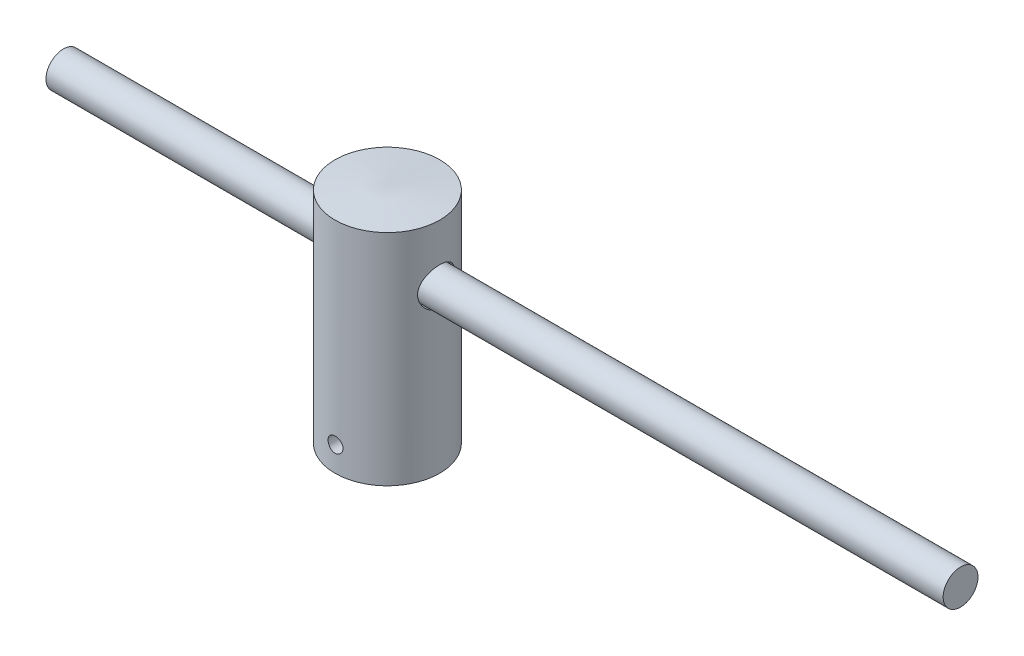
ISO-10303-21;
HEADER;
FILE_DESCRIPTION(('STEP AP214'),'2;1');
FILE_NAME('part.step','',(''),(''),'','','');
FILE_SCHEMA(('AUTOMOTIVE_DESIGN { 1 0 10303 214 1 1 1 1 }'));
ENDSEC;
DATA;
#1=APPLICATION_CONTEXT('core data for automotive mechanical design processes');
#2=APPLICATION_PROTOCOL_DEFINITION('international standard','automotive_design',2000,#1);
#3=PRODUCT_CONTEXT('',#1,'mechanical');
#4=PRODUCT('Part','Part','',(#3));
#5=PRODUCT_RELATED_PRODUCT_CATEGORY('part','',(#4));
#6=PRODUCT_DEFINITION_FORMATION('','',#4);
#7=PRODUCT_DEFINITION_CONTEXT('part definition',#1,'design');
#8=PRODUCT_DEFINITION('design','',#6,#7);
#9=PRODUCT_DEFINITION_SHAPE('','',#8);
#10=(LENGTH_UNIT() NAMED_UNIT(*) SI_UNIT(.MILLI.,.METRE.));
#11=(NAMED_UNIT(*) PLANE_ANGLE_UNIT() SI_UNIT($,.RADIAN.));
#12=(NAMED_UNIT(*) SI_UNIT($,.STERADIAN.) SOLID_ANGLE_UNIT());
#13=UNCERTAINTY_MEASURE_WITH_UNIT(LENGTH_MEASURE(1.E-05),#10,'distance_accuracy_value','');
#14=(GEOMETRIC_REPRESENTATION_CONTEXT(3) GLOBAL_UNCERTAINTY_ASSIGNED_CONTEXT((#13)) GLOBAL_UNIT_ASSIGNED_CONTEXT((#10,
#11,#12)) REPRESENTATION_CONTEXT('',''));
#15=CARTESIAN_POINT('',(0.,0.,0.));
#16=DIRECTION('',(0.,0.,1.));
#17=DIRECTION('',(1.,0.,0.));
#18=AXIS2_PLACEMENT_3D('',#15,#16,#17);
#19=CARTESIAN_POINT('',(-130.,65.,0.));
#20=DIRECTION('',(1.,0.,0.));
#21=DIRECTION('',(0.,0.,-1.));
#22=AXIS2_PLACEMENT_3D('',#19,#20,#21);
#23=CYLINDRICAL_SURFACE('',#22,6.99209056168372);
#24=CARTESIAN_POINT('',(-130.,65.,0.));
#25=DIRECTION('',(1.,0.,0.));
#26=DIRECTION('',(0.,0.,-1.));
#27=AXIS2_PLACEMENT_3D('',#24,#25,#26);
#28=CIRCLE('',#27,6.99209056168372);
#29=CARTESIAN_POINT('',(-130.,65.,-6.99209056168372));
#30=VERTEX_POINT('',#29);
#31=EDGE_CURVE('E11',#30,#30,#28,.T.);
#32=ORIENTED_EDGE('',*,*,#31,.T.);
#33=EDGE_LOOP('',(#32));
#34=FACE_BOUND('',#33,.T.);
#35=CARTESIAN_POINT('',(230.,65.,0.));
#36=DIRECTION('',(1.,0.,0.));
#37=DIRECTION('',(0.,0.,-1.));
#38=AXIS2_PLACEMENT_3D('',#35,#36,#37);
#39=CIRCLE('',#38,6.99209056168372);
#40=CARTESIAN_POINT('',(230.,65.,-6.99209056168372));
#41=VERTEX_POINT('',#40);
#42=EDGE_CURVE('E47',#41,#41,#39,.T.);
#43=ORIENTED_EDGE('',*,*,#42,.F.);
#44=EDGE_LOOP('',(#43));
#45=FACE_BOUND('',#44,.T.);
#46=ADVANCED_FACE('F41',(#34,#45),#23,.T.);
#47=CARTESIAN_POINT('',(-130.,65.,0.));
#48=DIRECTION('',(1.,0.,0.));
#49=DIRECTION('',(0.,0.,-1.));
#50=AXIS2_PLACEMENT_3D('',#47,#48,#49);
#51=PLANE('',#50);
#52=ORIENTED_EDGE('',*,*,#31,.F.);
#53=EDGE_LOOP('',(#52));
#54=FACE_BOUND('',#53,.T.);
#55=ADVANCED_FACE('F56',(#54),#51,.F.);
#56=CARTESIAN_POINT('',(230.,65.,0.));
#57=DIRECTION('',(1.,0.,0.));
#58=DIRECTION('',(0.,0.,-1.));
#59=AXIS2_PLACEMENT_3D('',#56,#57,#58);
#60=PLANE('',#59);
#61=ORIENTED_EDGE('',*,*,#42,.T.);
#62=EDGE_LOOP('',(#61));
#63=FACE_BOUND('',#62,.T.);
#64=ADVANCED_FACE('F53',(#63),#60,.T.);
#65=CLOSED_SHELL('',(#46,#55,#64));
#66=MANIFOLD_SOLID_BREP('B2',#65);
#67=CARTESIAN_POINT('',(0.,19.2494269938011,0.));
#68=DIRECTION('',(0.,1.,0.));
#69=DIRECTION('',(0.,0.,1.));
#70=AXIS2_PLACEMENT_3D('',#67,#68,#69);
#71=CYLINDRICAL_SURFACE('',#70,21.);
#72=CARTESIAN_POINT('',(-21.,72.5,0.));
#73=CARTESIAN_POINT('',(-21.0000003810516,72.5000005363568,-0.20374922618558));
#74=CARTESIAN_POINT('',(-20.9970281712498,72.4916907794428,-0.407490675864005));
#75=CARTESIAN_POINT('',(-20.985221568696,72.4585364170613,-0.813454356854692));
#76=CARTESIAN_POINT('',(-20.9763871824079,72.4336918298256,-1.01567658984185));
#77=CARTESIAN_POINT('',(-20.9530966718926,72.3677140587623,-1.4170962565951));
#78=CARTESIAN_POINT('',(-20.938640980598,72.3265821293227,-1.61629392207521));
#79=CARTESIAN_POINT('',(-20.90449489973,72.2284177092016,-2.01027190534673));
#80=CARTESIAN_POINT('',(-20.8848044170413,72.1713849356789,-2.20505214449517));
#81=CARTESIAN_POINT('',(-20.8407519298997,72.0420612505437,-2.58847971348074));
#82=CARTESIAN_POINT('',(-20.8163995609771,71.9698017800823,-2.77713877045418));
#83=CARTESIAN_POINT('',(-20.7636131163567,71.8105267445053,-3.14760137243779));
#84=CARTESIAN_POINT('',(-20.7351776236549,71.7235060547595,-3.32940250970902));
#85=CARTESIAN_POINT('',(-20.6749513548944,71.5354072492348,-3.68495547941489));
#86=CARTESIAN_POINT('',(-20.6431611165465,71.4343313854481,-3.85870859541115));
#87=CARTESIAN_POINT('',(-20.5769959385094,71.2187847383418,-4.19726138746945));
#88=CARTESIAN_POINT('',(-20.5426200697334,71.1043091318351,-4.36205780815527));
#89=CARTESIAN_POINT('',(-20.4708979079837,70.858494600442,-4.6873275904472));
#90=CARTESIAN_POINT('',(-20.4334897355097,70.7267052975204,-4.84744706169194));
#91=CARTESIAN_POINT('',(-20.3577917988584,70.4504432303281,-5.15611984149657));
#92=CARTESIAN_POINT('',(-20.31950201173,70.3059701355822,-5.3046728485027));
#93=CARTESIAN_POINT('',(-20.2430325297971,70.0051504838689,-5.58939854738355));
#94=CARTESIAN_POINT('',(-20.2048528888019,69.8487988982054,-5.72556594167039));
#95=CARTESIAN_POINT('',(-20.1296574136624,69.5252461914804,-5.98456978175054));
#96=CARTESIAN_POINT('',(-20.0926411879885,69.358048779731,-6.10741074722057));
#97=CARTESIAN_POINT('',(-20.0195447238613,69.0078039224979,-6.34299322543321));
#98=CARTESIAN_POINT('',(-19.9835402998257,68.8244093246782,-6.45524294854224));
#99=CARTESIAN_POINT('',(-19.9149719598628,68.4482298485128,-6.66377833599417));
#100=CARTESIAN_POINT('',(-19.8824067643259,68.2554485019121,-6.76006994540559));
#101=CARTESIAN_POINT('',(-19.8217477215098,67.861730867444,-6.93591912307201));
#102=CARTESIAN_POINT('',(-19.7936535229621,67.6607952217858,-7.01547800610893));
#103=CARTESIAN_POINT('',(-19.7428794672938,67.2521917401856,-7.15712087737874));
#104=CARTESIAN_POINT('',(-19.7201993257047,67.0445242586031,-7.21920578377031));
#105=CARTESIAN_POINT('',(-19.6817901185185,66.6320005871443,-7.32325729118184));
#106=CARTESIAN_POINT('',(-19.6658304611613,66.4273354635075,-7.36589638345197));
#107=CARTESIAN_POINT('',(-19.6401986039845,66.0147785485371,-7.43397115490169));
#108=CARTESIAN_POINT('',(-19.630526064353,65.8068869322138,-7.45940776385967));
#109=CARTESIAN_POINT('',(-19.6178050549232,65.3895643424967,-7.49279957655505));
#110=CARTESIAN_POINT('',(-19.6147545997322,65.1801338493793,-7.50076001989667));
#111=CARTESIAN_POINT('',(-19.615379526299,64.7613551297721,-7.49912586169239));
#112=CARTESIAN_POINT('',(-19.6190546799858,64.5520069007334,-7.48953185543191));
#113=CARTESIAN_POINT('',(-19.6326246436368,64.146281450242,-7.45388383321767));
#114=CARTESIAN_POINT('',(-19.6421746424614,63.9498116942469,-7.42874196130756));
#115=CARTESIAN_POINT('',(-19.6668861771582,63.5597541033493,-7.3630712300169));
#116=CARTESIAN_POINT('',(-19.6820495535895,63.3661672353922,-7.32253732366088));
#117=CARTESIAN_POINT('',(-19.7175242634513,62.9832962337792,-7.22646893238065));
#118=CARTESIAN_POINT('',(-19.737834229786,62.7940109720087,-7.17093843076608));
#119=CARTESIAN_POINT('',(-19.7830191374593,62.4208191375838,-7.04532511235293));
#120=CARTESIAN_POINT('',(-19.8078958192165,62.2369146466779,-6.97523674607068));
#121=CARTESIAN_POINT('',(-19.861976746623,61.8725166896213,-6.8197338039181));
#122=CARTESIAN_POINT('',(-19.8912486222834,61.6921378637165,-6.73407428540257));
#123=CARTESIAN_POINT('',(-19.9529856831819,61.3391457987089,-6.54888444422275));
#124=CARTESIAN_POINT('',(-19.9854519551971,61.1665352317839,-6.4493493960803));
#125=CARTESIAN_POINT('',(-20.0527070880428,60.8300792618337,-6.23709299084689));
#126=CARTESIAN_POINT('',(-20.0874961671456,60.6662346851547,-6.12437039378196));
#127=CARTESIAN_POINT('',(-20.1585021087452,60.3482003787496,-5.88644235055393));
#128=CARTESIAN_POINT('',(-20.1947190295132,60.1940110437266,-5.76123639461683));
#129=CARTESIAN_POINT('',(-20.2698966308978,59.8870576705367,-5.49109434290394));
#130=CARTESIAN_POINT('',(-20.3088903501962,59.7349490688169,-5.34542176541262));
#131=CARTESIAN_POINT('',(-20.3863902720736,59.443504603503,-5.04178840291438));
#132=CARTESIAN_POINT('',(-20.4248966214334,59.3041648114501,-4.88383142516874));
#133=CARTESIAN_POINT('',(-20.5004138581661,59.0390329744161,-4.55645258274398));
#134=CARTESIAN_POINT('',(-20.5374239787312,58.9132478224565,-4.38702495546978));
#135=CARTESIAN_POINT('',(-20.6089136572418,58.6762283831301,-4.03787261993808));
#136=CARTESIAN_POINT('',(-20.6433942186196,58.5649883121318,-3.85815204564512));
#137=CARTESIAN_POINT('',(-20.7093392629055,58.356457936562,-3.48701232511264));
#138=CARTESIAN_POINT('',(-20.7407573854129,58.2593734742781,-3.29546911991382));
#139=CARTESIAN_POINT('',(-20.7991423769345,58.0818098762803,-2.90426698302876));
#140=CARTESIAN_POINT('',(-20.8261109936778,58.001324217573,-2.70461127645546));
#141=CARTESIAN_POINT('',(-20.8748266299074,57.8576645516751,-2.2985678507468));
#142=CARTESIAN_POINT('',(-20.8965742790775,57.7944884567047,-2.0921809468529));
#143=CARTESIAN_POINT('',(-20.9342058498115,57.6860705695252,-1.67422766214545));
#144=CARTESIAN_POINT('',(-20.9500900859828,57.6408278150745,-1.46266155987686));
#145=CARTESIAN_POINT('',(-20.9748940759281,57.5705177480786,-1.04648402034207));
#146=CARTESIAN_POINT('',(-20.9841165402028,57.5445716633572,-0.84203872873714));
#147=CARTESIAN_POINT('',(-20.9965698462835,57.50959181003,-0.431527335545403));
#148=CARTESIAN_POINT('',(-20.9998009100344,57.5005574149485,-0.225461294281526));
#149=CARTESIAN_POINT('',(-21.0001811885606,57.4994927090519,0.186683488447177));
#150=CARTESIAN_POINT('',(-20.997331453116,57.5074594631835,0.392762221579025));
#151=CARTESIAN_POINT('',(-20.9856319191329,57.5403094820346,0.803392653199922));
#152=CARTESIAN_POINT('',(-20.9767821975247,57.5651925298579,1.00794437123396));
#153=CARTESIAN_POINT('',(-20.9537333077164,57.6304793183805,1.40699201212888));
#154=CARTESIAN_POINT('',(-20.9397286698676,57.6703195946823,1.60159177108016));
#155=CARTESIAN_POINT('',(-20.9067082485523,57.7651933643484,1.98668319578029));
#156=CARTESIAN_POINT('',(-20.8876908067584,57.8202318858584,2.17717347943642));
#157=CARTESIAN_POINT('',(-20.8451303655555,57.9450091423219,2.55269301105831));
#158=CARTESIAN_POINT('',(-20.8215885875091,58.0147439104547,2.73772371734372));
#159=CARTESIAN_POINT('',(-20.7705461329668,58.1683942676792,3.10131125455071));
#160=CARTESIAN_POINT('',(-20.7430439565874,58.2523152314751,3.27986560052499));
#161=CARTESIAN_POINT('',(-20.6839387126469,58.4362273457668,3.63425989160507));
#162=CARTESIAN_POINT('',(-20.6522428011238,58.5366008067195,3.80988592008421));
#163=CARTESIAN_POINT('',(-20.5861592917809,58.7509719201664,4.15216110518901));
#164=CARTESIAN_POINT('',(-20.5517707691071,58.8649742610336,4.31880714390743));
#165=CARTESIAN_POINT('',(-20.4811587516689,59.1058401866037,4.64214676449224));
#166=CARTESIAN_POINT('',(-20.4449350250787,59.2327053982017,4.7988390833259));
#167=CARTESIAN_POINT('',(-20.3715502904862,59.498511459249,5.10138952445933));
#168=CARTESIAN_POINT('',(-20.3343892526384,59.6374526935642,5.24724730118454));
#169=CARTESIAN_POINT('',(-20.2580914243843,59.9342424917553,5.5347085066744));
#170=CARTESIAN_POINT('',(-20.2189537829847,60.0927017325284,5.67568199313652));
#171=CARTESIAN_POINT('',(-20.1417711703012,60.421091504049,5.94377932163782));
#172=CARTESIAN_POINT('',(-20.103725847122,60.5910182800045,6.07090766167138));
#173=CARTESIAN_POINT('',(-20.0297914257965,60.9414431936632,6.3105620133107));
#174=CARTESIAN_POINT('',(-19.9939033281997,61.1219461612576,6.423081276675));
#175=CARTESIAN_POINT('',(-19.9253902921786,61.492256443821,6.63256872058112));
#176=CARTESIAN_POINT('',(-19.8927639874725,61.6820598130235,6.72954342270005));
#177=CARTESIAN_POINT('',(-19.8317291730711,62.0701120108024,6.90734196879382));
#178=CARTESIAN_POINT('',(-19.8033272787358,62.2683734727339,6.98814054826929));
#179=CARTESIAN_POINT('',(-19.7517454068301,62.6716092182904,7.13263226499261));
#180=CARTESIAN_POINT('',(-19.7285632742586,62.8765806914775,7.19633246347536));
#181=CARTESIAN_POINT('',(-19.6882067233635,63.2917412098529,7.30602055083928));
#182=CARTESIAN_POINT('',(-19.6710308394705,63.5019289688037,7.35201276087867));
#183=CARTESIAN_POINT('',(-19.6432929629954,63.9259015110794,7.42580656271277));
#184=CARTESIAN_POINT('',(-19.6327305678251,64.1396860746392,7.45360926177694));
#185=CARTESIAN_POINT('',(-19.6190191685864,64.5564678556715,7.48962147186352));
#186=CARTESIAN_POINT('',(-19.615471330387,64.7593615093909,7.49888546968745));
#187=CARTESIAN_POINT('',(-19.614691614171,65.1652419736128,7.50092504129694));
#188=CARTESIAN_POINT('',(-19.6174595603318,65.3682287813648,7.49370107408394));
#189=CARTESIAN_POINT('',(-19.6292196469906,65.7727483445713,7.46284168144581));
#190=CARTESIAN_POINT('',(-19.6382112642765,65.974281220816,7.43920763558364));
#191=CARTESIAN_POINT('',(-19.6621249112348,66.3744255519295,7.37577047765268));
#192=CARTESIAN_POINT('',(-19.6770469486956,66.5730370029611,7.33596734434881));
#193=CARTESIAN_POINT('',(-19.7118987278182,66.9609502001794,7.24178833075198));
#194=CARTESIAN_POINT('',(-19.7316920362282,67.1503603284884,7.18780715645808));
#195=CARTESIAN_POINT('',(-19.7758888598513,67.5239255276664,7.06529958358312));
#196=CARTESIAN_POINT('',(-19.8002939018927,67.7080788348265,6.99676836692036));
#197=CARTESIAN_POINT('',(-19.8530230260859,68.0699436049032,6.84571900682037));
#198=CARTESIAN_POINT('',(-19.8813464405889,68.247656158759,6.76320324566223));
#199=CARTESIAN_POINT('',(-19.9411537561819,68.5956998861985,6.58477330804461));
#200=CARTESIAN_POINT('',(-19.9726388792857,68.7660281690316,6.48885394538428));
#201=CARTESIAN_POINT('',(-20.0737851956973,69.2805695731914,6.17202295503216));
#202=CARTESIAN_POINT('',(-20.1474848969218,69.6108756547118,5.92929000232938));
#203=CARTESIAN_POINT('',(-20.2974294582159,70.2273710086492,5.39364701200401));
#204=CARTESIAN_POINT('',(-20.3736750822788,70.5135468908554,5.10072180148509));
#205=CARTESIAN_POINT('',(-20.4858363888957,70.9107209924108,4.62160836442627));
#206=CARTESIAN_POINT('',(-20.5236794040509,71.0402804051611,4.45095268758888));
#207=CARTESIAN_POINT('',(-20.5968864447148,71.2845293587603,4.09884639312128));
#208=CARTESIAN_POINT('',(-20.6322514008331,71.3992244956313,3.9173998757205));
#209=CARTESIAN_POINT('',(-20.6995253298715,71.6129147487263,3.54478695548017));
#210=CARTESIAN_POINT('',(-20.7314329723786,71.7119038278386,3.35361685218406));
#211=CARTESIAN_POINT('',(-20.7908567210666,71.8932621536529,2.96298497408958));
#212=CARTESIAN_POINT('',(-20.8183747346387,71.9756386230364,2.7635268483717));
#213=CARTESIAN_POINT('',(-20.8683456171222,72.1233916209485,2.35676094636663));
#214=CARTESIAN_POINT('',(-20.8907752456181,72.1886903488701,2.14942201110688));
#215=CARTESIAN_POINT('',(-20.9297375531609,72.3011436996212,1.7293289794983));
#216=CARTESIAN_POINT('',(-20.9462701613011,72.3482981042812,1.51657481806893));
#217=CARTESIAN_POINT('',(-20.9729268107105,72.423941899677,1.08744616397812));
#218=CARTESIAN_POINT('',(-20.9830529466634,72.4524373913064,0.871072878414159));
#219=CARTESIAN_POINT('',(-20.9965891316789,72.4904655738222,0.436463345011874));
#220=CARTESIAN_POINT('',(-20.9999995918717,72.4999994255309,0.218227212037681));
#221=CARTESIAN_POINT('',(-21.,72.5,0.));
#222=B_SPLINE_CURVE_WITH_KNOTS('',3,(#72,#73,#74,#75,#76,#77,#78,#79,#80,#81,#82,#83,#84,#85,
#86,#87,#88,#89,#90,#91,#92,#93,#94,#95,#96,#97,#98,#99,#100,#101,#102,#103,#104,#105,#106,#107,
#108,#109,#110,#111,#112,#113,#114,#115,#116,#117,#118,#119,#120,#121,#122,#123,#124,#125,#126,
#127,#128,#129,#130,#131,#132,#133,#134,#135,#136,#137,#138,#139,#140,#141,#142,#143,#144,#145,
#146,#147,#148,#149,#150,#151,#152,#153,#154,#155,#156,#157,#158,#159,#160,#161,#162,#163,#164,
#165,#166,#167,#168,#169,#170,#171,#172,#173,#174,#175,#176,#177,#178,#179,#180,#181,#182,#183,
#184,#185,#186,#187,#188,#189,#190,#191,#192,#193,#194,#195,#196,#197,#198,#199,#200,#201,#202,
#203,#204,#205,#206,#207,#208,#209,#210,#211,#212,#213,#214,#215,#216,#217,#218,#219,#220,#221),
.UNSPECIFIED.,.T.,.F.,(4,2,2,2,2,2,2,2,2,2,2,2,2,2,2,2,2,2,2,2,2,2,2,2,2,2,2,2,2,2,2,2,2,2,2,2,
2,2,2,2,2,2,2,2,2,2,2,2,2,2,2,2,2,2,2,2,2,2,2,2,2,2,2,2,2,2,2,2,2,2,2,2,2,2,4),(0.,
0.611044132039879,1.22208759032251,1.83308399755512,2.444091273768,3.05384905010863,
3.6638189500155,4.27369122978189,4.88378370976459,5.51525663850016,6.14674602510165,
6.77850425525973,7.41004754945584,8.06328199199794,8.71627252750716,9.36921173478995,
10.0221166274008,10.6503108641732,11.2784711449109,11.906443068484,12.534393697422,
13.1286027202202,13.7230067498298,14.3172530522687,14.9117262995606,15.5165197015441,
16.1215195786632,16.7265763873582,17.3316579144525,17.9734922695032,18.6151284897875,
19.2570894804428,19.8987944236635,20.5490580649612,21.1990656768324,21.8489948539846,
22.4988891534427,23.1169880240698,23.7350639974289,24.3530332757041,24.9709946306905,
25.5676942795542,26.1645915758934,26.7613279631959,27.3582909439843,27.9718713163964,
28.5856633728627,29.1995331587884,29.8134225160795,30.4596841304044,31.1057351577496,
31.752083555985,32.3981600709447,33.0452379136885,33.6920481157015,34.3387003808968,
34.9853132780765,35.5939634189303,36.2025966160382,36.8111786527468,37.4197614887171,
38.0129274440146,38.6062901267069,39.1995518309739,39.7930437224708,41.0366567215566,
42.2806463247071,42.9327171422873,43.584541754198,44.2366163113363,44.8884067512212,
45.5431167545441,46.1978346299334,46.8523383255764,47.5068019515908),.UNSPECIFIED.);
#223=CARTESIAN_POINT('',(-21.,72.5,0.));
#224=VERTEX_POINT('',#223);
#225=EDGE_CURVE('E39',#224,#224,#222,.T.);
#226=ORIENTED_EDGE('',*,*,#225,.F.);
#227=EDGE_LOOP('',(#226));
#228=FACE_BOUND('',#227,.T.);
#229=CARTESIAN_POINT('',(19.615045245933,65.,-7.50000000000001));
#230=CARTESIAN_POINT('',(19.6150447670643,65.2032803024815,-7.50000055518975));
#231=CARTESIAN_POINT('',(19.6182137941462,65.4065527092552,-7.49172867514459));
#232=CARTESIAN_POINT('',(19.6307837848207,65.8115650728511,-7.45872914623714));
#233=CARTESIAN_POINT('',(19.6401847633366,66.0133050260026,-7.43400145796937));
#234=CARTESIAN_POINT('',(19.6649118884163,66.4137555013908,-7.36834218067001));
#235=CARTESIAN_POINT('',(19.6802380337111,66.6124660242764,-7.3274105951091));
#236=CARTESIAN_POINT('',(19.716327336131,67.0054564372987,-7.2297401241124));
#237=CARTESIAN_POINT('',(19.737090603043,67.1997362378836,-7.17300091948617));
#238=CARTESIAN_POINT('',(19.7833587440972,67.5820957095414,-7.04438574105221));
#239=CARTESIAN_POINT('',(19.8088519464002,67.7701893291638,-6.97254697097581));
#240=CARTESIAN_POINT('',(19.8638739285575,68.1395634875481,-6.81421558054032));
#241=CARTESIAN_POINT('',(19.8934041138899,68.3208416253469,-6.72771785413202));
#242=CARTESIAN_POINT('',(19.9556588092682,68.6754299396379,-6.54074792718216));
#243=CARTESIAN_POINT('',(19.9883828872962,68.8487411891093,-6.44027761584625));
#244=CARTESIAN_POINT('',(20.0561594074473,69.1865165915411,-6.22600172757715));
#245=CARTESIAN_POINT('',(20.091212687483,69.3509775217377,-6.11219134028183));
#246=CARTESIAN_POINT('',(20.1641865370976,69.6766028372198,-5.86707653932671));
#247=CARTESIAN_POINT('',(20.2021657404097,69.8373600248745,-5.73524834866052));
#248=CARTESIAN_POINT('',(20.2786180847038,70.1473211965175,-5.4587742039024));
#249=CARTESIAN_POINT('',(20.3170912367886,70.2965249202816,-5.31412796126074));
#250=CARTESIAN_POINT('',(20.3935214464471,70.5825368521613,-5.01282778358481));
#251=CARTESIAN_POINT('',(20.431478312898,70.7193405706782,-4.85616953702909));
#252=CARTESIAN_POINT('',(20.5058491228181,70.9795814983578,-4.5318665956045));
#253=CARTESIAN_POINT('',(20.5422635983779,71.1030233403114,-4.36422574116336));
#254=CARTESIAN_POINT('',(20.6136948439598,71.3393609714963,-4.01354925305805));
#255=CARTESIAN_POINT('',(20.6486335547648,71.4518125200111,-3.8301978463723));
#256=CARTESIAN_POINT('',(20.7148695672051,71.6607536101794,-3.45407353030378));
#257=CARTESIAN_POINT('',(20.7461682257485,71.7572491054909,-3.26130416996665));
#258=CARTESIAN_POINT('',(20.8042409241113,71.9334959609181,-2.86760270907143));
#259=CARTESIAN_POINT('',(20.8310151529941,72.0132480207295,-2.66667095003291));
#260=CARTESIAN_POINT('',(20.8792549212092,72.1552603574421,-2.25810014498465));
#261=CARTESIAN_POINT('',(20.900720724635,72.2175215045349,-2.05046143322628));
#262=CARTESIAN_POINT('',(20.9369724595446,72.321824249659,-1.63837281099333));
#263=CARTESIAN_POINT('',(20.951988587254,72.3645668651759,-1.43412046948895));
#264=CARTESIAN_POINT('',(20.9761091258023,72.4329119009837,-1.02242632744536));
#265=CARTESIAN_POINT('',(20.9852138101725,72.458515114342,-0.814984674935063));
#266=CARTESIAN_POINT('',(20.9972505045753,72.492314626272,-0.398559749458603));
#267=CARTESIAN_POINT('',(21.000184007056,72.5005151335448,-0.189576861498642));
#268=CARTESIAN_POINT('',(20.9997981095233,72.4994347928021,0.228335180074842));
#269=CARTESIAN_POINT('',(20.9964788785977,72.4901544175083,0.437264334988617));
#270=CARTESIAN_POINT('',(20.9839737616737,72.455025574372,0.844017651723146));
#271=CARTESIAN_POINT('',(20.9750597211401,72.4299446377546,1.04191704568063));
#272=CARTESIAN_POINT('',(20.9518484921181,72.3641633895244,1.4348485227359));
#273=CARTESIAN_POINT('',(20.9375495270247,72.3234579229503,1.62987963743597));
#274=CARTESIAN_POINT('',(20.9039414359622,72.2268123835607,2.01561539231386));
#275=CARTESIAN_POINT('',(20.8846339318383,72.1708772420673,2.20632141132882));
#276=CARTESIAN_POINT('',(20.8414855572985,72.0442220407378,2.58230598983492));
#277=CARTESIAN_POINT('',(20.8176429722475,71.9734963878577,2.76758246583483));
#278=CARTESIAN_POINT('',(20.765666387993,71.8167762092565,3.13397571848474));
#279=CARTESIAN_POINT('',(20.7374783145666,71.7305866653112,3.31500134887542));
#280=CARTESIAN_POINT('',(20.6777465612265,71.5442335410281,3.66920572822596));
#281=CARTESIAN_POINT('',(20.6462017363753,71.4440651890772,3.84238177090474));
#282=CARTESIAN_POINT('',(20.5805343797436,71.2304671801756,4.17985166014691));
#283=CARTESIAN_POINT('',(20.5464116538099,71.1170365240288,4.34414483610022));
#284=CARTESIAN_POINT('',(20.4764161945623,70.8776458258923,4.6629410036605));
#285=CARTESIAN_POINT('',(20.4405433878636,70.7516852582641,4.81744358409971));
#286=CARTESIAN_POINT('',(20.3659611188873,70.480894860604,5.12384698105041));
#287=CARTESIAN_POINT('',(20.3272028134452,70.335414776893,5.2751618057852));
#288=CARTESIAN_POINT('',(20.2497628200464,70.0323303986232,5.56503468590094));
#289=CARTESIAN_POINT('',(20.2110811122533,69.8747298324756,5.70359663564191));
#290=CARTESIAN_POINT('',(20.1348212347983,69.5482121813542,5.96722869150979));
#291=CARTESIAN_POINT('',(20.0972437118938,69.3792886469808,6.09229100074736));
#292=CARTESIAN_POINT('',(20.0242924713956,69.0312800444747,6.32794789765442));
#293=CARTESIAN_POINT('',(19.9889178972121,68.8521989783883,6.43854812735704));
#294=CARTESIAN_POINT('',(19.9207532335694,68.4814127579886,6.64648739855475));
#295=CARTESIAN_POINT('',(19.8880249127895,68.2895325525497,6.74353502535966));
#296=CARTESIAN_POINT('',(19.8269724640454,67.8976329252264,6.92098045672197));
#297=CARTESIAN_POINT('',(19.7986465944068,67.6976167617624,7.00138484978623));
#298=CARTESIAN_POINT('',(19.7473335603474,67.2908245183929,7.14483208610425));
#299=CARTESIAN_POINT('',(19.7243453361935,67.0840497896447,7.20787837608828));
#300=CARTESIAN_POINT('',(19.6845042432106,66.66527350521,7.31598387992431));
#301=CARTESIAN_POINT('',(19.6676510004286,66.4532722689427,7.3610441901143));
#302=CARTESIAN_POINT('',(19.641374523921,66.0366282833857,7.43086293442179));
#303=CARTESIAN_POINT('',(19.6316169396673,65.8321598107087,7.45653751451895));
#304=CARTESIAN_POINT('',(19.6185030472952,65.4216021155907,7.49097334958786));
#305=CARTESIAN_POINT('',(19.6151464660411,65.215512962682,7.49973532623337));
#306=CARTESIAN_POINT('',(19.6149485609945,64.80335051523,7.50025281276369));
#307=CARTESIAN_POINT('',(19.6181060077236,64.597277225034,7.49201153189743));
#308=CARTESIAN_POINT('',(19.6308263474053,64.1867083787303,7.45861751801893));
#309=CARTESIAN_POINT('',(19.6403891377466,63.9822127974013,7.43346505591748));
#310=CARTESIAN_POINT('',(19.6650714426541,63.5848257187798,7.36791229634306));
#311=CARTESIAN_POINT('',(19.6799425069577,63.3918060176793,7.32819186092932));
#312=CARTESIAN_POINT('',(19.7148284252235,63.0098642589306,7.23381429227787));
#313=CARTESIAN_POINT('',(19.7348449700465,62.8209435704344,7.17915224869079));
#314=CARTESIAN_POINT('',(19.7794327480716,62.4485021720896,7.05537817622268));
#315=CARTESIAN_POINT('',(19.8040030073786,62.264980317308,6.98626923667088));
#316=CARTESIAN_POINT('',(19.8570246446707,61.904315229268,6.83411012080573));
#317=CARTESIAN_POINT('',(19.8854775015188,61.7271744591885,6.75105462952455));
#318=CARTESIAN_POINT('',(19.9465387390797,61.3743073524223,6.56849839376502));
#319=CARTESIAN_POINT('',(19.9792570979328,61.1988436494866,6.46852680317899));
#320=CARTESIAN_POINT('',(20.0471398184912,60.856821883945,6.25497703382267));
#321=CARTESIAN_POINT('',(20.0823050204754,60.6902669157951,6.14139417099034));
#322=CARTESIAN_POINT('',(20.1541474319754,60.3670206345006,5.90135858917506));
#323=CARTESIAN_POINT('',(20.1908248290416,60.2103305509783,5.77490427093175));
#324=CARTESIAN_POINT('',(20.2647494897835,59.9076912328985,5.50988666803687));
#325=CARTESIAN_POINT('',(20.3019967695808,59.7617423028843,5.37132304029425));
#326=CARTESIAN_POINT('',(20.3782354997607,59.4734373634752,5.07467012372221));
#327=CARTESIAN_POINT('',(20.417205896993,59.3317559200274,4.91591888788194));
#328=CARTESIAN_POINT('',(20.4936539113377,59.0622779308787,4.58679386956002));
#329=CARTESIAN_POINT('',(20.5311320158988,58.9344768272856,4.41642393241323));
#330=CARTESIAN_POINT('',(20.6035930569911,58.6935545814404,4.06499064199812));
#331=CARTESIAN_POINT('',(20.6385749857326,58.5804393534325,3.88392302304581));
#332=CARTESIAN_POINT('',(20.7050411229691,58.3698636025321,3.51238734558814));
#333=CARTESIAN_POINT('',(20.736526812288,58.2723964440783,3.32192331665945));
#334=CARTESIAN_POINT('',(20.7949926208202,58.0942948398713,2.93370570622313));
#335=CARTESIAN_POINT('',(20.8219930804186,58.0135839637755,2.73599029068247));
#336=CARTESIAN_POINT('',(20.870885556903,57.8691879420306,2.33390822376345));
#337=CARTESIAN_POINT('',(20.8927796508378,57.805495872326,2.12954431538383));
#338=CARTESIAN_POINT('',(20.9308325350641,57.6957270680213,1.71564277772247));
#339=CARTESIAN_POINT('',(20.9469921447012,57.6496478168218,1.50610589213747));
#340=CARTESIAN_POINT('',(20.9730990241486,57.5755749055276,1.08348025172078));
#341=CARTESIAN_POINT('',(20.9830466105701,57.5475803237004,0.870391678478115));
#342=CARTESIAN_POINT('',(20.9960737179908,57.51098249628,0.453838702070483));
#343=CARTESIAN_POINT('',(20.9994917663573,57.501423189402,0.250468317236021));
#344=CARTESIAN_POINT('',(21.0004028631408,57.4988718505376,-0.156387972264551));
#345=CARTESIAN_POINT('',(20.9978960597937,57.5058794040598,-0.359873873913163));
#346=CARTESIAN_POINT('',(20.987026315877,57.5363899228752,-0.765423025798885));
#347=CARTESIAN_POINT('',(20.9786639920837,57.55989115085,-0.967486423607823));
#348=CARTESIAN_POINT('',(20.9563104380604,57.6231563805487,-1.36873264643141));
#349=CARTESIAN_POINT('',(20.9423192025271,57.662920397595,-1.56791546873184));
#350=CARTESIAN_POINT('',(20.9094262388517,57.7573471802907,-1.95790642118421));
#351=CARTESIAN_POINT('',(20.8906320737311,57.8116847422959,-2.1488025577184));
#352=CARTESIAN_POINT('',(20.8484719467438,57.9351470333994,-2.52529581286665));
#353=CARTESIAN_POINT('',(20.8251044614165,58.0042766907465,-2.71089114200654));
#354=CARTESIAN_POINT('',(20.7743810609969,58.1567495136813,-3.07554163602199));
#355=CARTESIAN_POINT('',(20.7470260185336,58.2400895701696,-3.25459822112953));
#356=CARTESIAN_POINT('',(20.6889876607782,58.4203740954032,-3.60519553819893));
#357=CARTESIAN_POINT('',(20.6583030625421,58.5173238124771,-3.77673333702467));
#358=CARTESIAN_POINT('',(20.5597942586657,58.8358201917426,-4.29183671637588));
#359=CARTESIAN_POINT('',(20.4875927637552,59.079015367024,-4.62149923233256));
#360=CARTESIAN_POINT('',(20.3391137464472,59.6152354625687,-5.23649426338664));
#361=CARTESIAN_POINT('',(20.2628348371291,59.9082774129844,-5.52181156397076));
#362=CARTESIAN_POINT('',(20.1495065618546,60.3871664029196,-5.91755536374112));
#363=CARTESIAN_POINT('',(20.1110696741688,60.5576276922386,-6.04657580385884));
#364=CARTESIAN_POINT('',(20.0363389509613,60.9092357605019,-6.28977619752925));
#365=CARTESIAN_POINT('',(20.0000443175692,61.090378510303,-6.40396169554874));
#366=CARTESIAN_POINT('',(19.9306773042722,61.4623045741057,-6.61669384768718));
#367=CARTESIAN_POINT('',(19.8976061970541,61.6530916510211,-6.71523433454555));
#368=CARTESIAN_POINT('',(19.8357593749253,62.0429144016325,-6.89577813065114));
#369=CARTESIAN_POINT('',(19.8069817822525,62.2419464204669,-6.97778867478423));
#370=CARTESIAN_POINT('',(19.7545431477259,62.6478426755645,-7.12489707688679));
#371=CARTESIAN_POINT('',(19.7309053444073,62.8547377109926,-7.18991837771842));
#372=CARTESIAN_POINT('',(19.6897359840952,63.2739624107592,-7.301908189441));
#373=CARTESIAN_POINT('',(19.6722044795798,63.486292121787,-7.34887654518385));
#374=CARTESIAN_POINT('',(19.6438923036596,63.9145798932396,-7.42422515104399));
#375=CARTESIAN_POINT('',(19.6331087592833,64.1305363692863,-7.45261331199134));
#376=CARTESIAN_POINT('',(19.6186857150085,64.5643316663852,-7.49049983609862));
#377=CARTESIAN_POINT('',(19.6150457590757,64.7821703663875,-7.49999940507381));
#378=CARTESIAN_POINT('',(19.615045245933,65.,-7.50000000000001));
#379=B_SPLINE_CURVE_WITH_KNOTS('',3,(#229,#230,#231,#232,#233,#234,#235,#236,#237,#238,#239,
#240,#241,#242,#243,#244,#245,#246,#247,#248,#249,#250,#251,#252,#253,#254,#255,#256,#257,#258,
#259,#260,#261,#262,#263,#264,#265,#266,#267,#268,#269,#270,#271,#272,#273,#274,#275,#276,#277,
#278,#279,#280,#281,#282,#283,#284,#285,#286,#287,#288,#289,#290,#291,#292,#293,#294,#295,#296,
#297,#298,#299,#300,#301,#302,#303,#304,#305,#306,#307,#308,#309,#310,#311,#312,#313,#314,#315,
#316,#317,#318,#319,#320,#321,#322,#323,#324,#325,#326,#327,#328,#329,#330,#331,#332,#333,#334,
#335,#336,#337,#338,#339,#340,#341,#342,#343,#344,#345,#346,#347,#348,#349,#350,#351,#352,#353,
#354,#355,#356,#357,#358,#359,#360,#361,#362,#363,#364,#365,#366,#367,#368,#369,#370,#371,#372,
#373,#374,#375,#376,#377,#378),.UNSPECIFIED.,.T.,.F.,(4,2,2,2,2,2,2,2,2,2,2,2,2,2,2,2,2,2,2,2,2,
2,2,2,2,2,2,2,2,2,2,2,2,2,2,2,2,2,2,2,2,2,2,2,2,2,2,2,2,2,2,2,2,2,2,2,2,2,2,2,2,2,2,2,2,2,2,2,2,
2,2,2,2,2,4),(0.,0.609635475224084,1.21927241030189,1.82890921480363,2.43855833010027,
3.04672258278623,3.65509911001276,4.2633934596771,4.87190783586456,5.50521063697745,
6.13852769811971,6.77207315235017,7.40539823715413,8.05831063271034,8.7109788556179,
9.36361979857287,10.0162282661868,10.643080523208,11.2699037727716,11.8965754130149,
12.5232301069199,13.1215710512868,13.7201095746772,14.3184545231401,14.9170261467118,
15.5237582164782,16.1306979008244,16.7376833421523,17.3446942576888,17.9843250374618,
18.6237598398452,19.2635620018687,19.9031138109683,20.5547997221933,21.2062271570074,
21.8575251469942,22.5087834309529,23.1269124267543,23.745015045934,24.3630010131314,
24.9809770806611,25.5731732159384,26.1655642026163,26.757828641547,27.3503193041728,
27.9633806054688,28.5766534893664,29.1900026647923,29.8033692237761,30.4515635016879,
31.099544284149,31.747785215023,32.3957505292105,33.0406919929992,33.685370663187,
34.3299571842946,34.9745108497677,35.5846299376184,36.1947337608647,36.8047733300499,
37.4148134740061,38.0122345972304,38.6098550726737,39.2073449618616,39.8050658988404,
41.0471532174964,42.2896657508039,42.9406392259746,43.5913686996593,44.2423540572754,
44.8930538675461,45.5466371813652,46.200226111993,46.8535365848172,47.5068053500845),.UNSPECIFIED.);
#380=CARTESIAN_POINT('',(19.615045245933,65.,-7.50000000000001));
#381=VERTEX_POINT('',#380);
#382=EDGE_CURVE('E94',#381,#381,#379,.T.);
#383=ORIENTED_EDGE('',*,*,#382,.F.);
#384=EDGE_LOOP('',(#383));
#385=FACE_BOUND('',#384,.T.);
#386=CARTESIAN_POINT('',(0.,0.,0.));
#387=DIRECTION('',(0.,1.,0.));
#388=DIRECTION('',(0.,0.,1.));
#389=AXIS2_PLACEMENT_3D('',#386,#387,#388);
#390=CIRCLE('',#389,21.);
#391=CARTESIAN_POINT('',(0.,0.,21.));
#392=VERTEX_POINT('',#391);
#393=EDGE_CURVE('E123',#392,#392,#390,.T.);
#394=ORIENTED_EDGE('',*,*,#393,.T.);
#395=EDGE_LOOP('',(#394));
#396=FACE_BOUND('',#395,.T.);
#397=CARTESIAN_POINT('',(0.,88.,0.));
#398=DIRECTION('',(0.,1.,0.));
#399=DIRECTION('',(0.,0.,1.));
#400=AXIS2_PLACEMENT_3D('',#397,#398,#399);
#401=CIRCLE('',#400,21.);
#402=CARTESIAN_POINT('',(0.,88.,21.));
#403=VERTEX_POINT('',#402);
#404=EDGE_CURVE('E126',#403,#403,#401,.T.);
#405=ORIENTED_EDGE('',*,*,#404,.F.);
#406=EDGE_LOOP('',(#405));
#407=FACE_BOUND('',#406,.T.);
#408=CARTESIAN_POINT('',(0.,7.,21.));
#409=CARTESIAN_POINT('',(-0.167596094119232,7.00000697976643,20.9999974056865));
#410=CARTESIAN_POINT('',(-0.33529171648655,7.0140916214782,20.9979726060089));
#411=CARTESIAN_POINT('',(-0.666001981104243,7.07004740870198,20.9900901151763));
#412=CARTESIAN_POINT('',(-0.829011796600435,7.11194620531114,20.9842286098892));
#413=CARTESIAN_POINT('',(-1.14551603035633,7.22225818520268,20.9693319048547));
#414=CARTESIAN_POINT('',(-1.29901730804931,7.29065199047952,20.9602990250489));
#415=CARTESIAN_POINT('',(-1.59233895072095,7.45196662868607,20.9400596724176));
#416=CARTESIAN_POINT('',(-1.73216134631595,7.54488381354874,20.9288535229507));
#417=CARTESIAN_POINT('',(-1.99517595119194,7.7533125135018,20.9054261736267));
#418=CARTESIAN_POINT('',(-2.11825677240195,7.86896392857374,20.8931989730243));
#419=CARTESIAN_POINT('',(-2.34333387530588,8.11927724361897,20.8691549946365));
#420=CARTESIAN_POINT('',(-2.44532898812609,8.25394019678956,20.8573382396341));
#421=CARTESIAN_POINT('',(-2.62576762926668,8.53919534816126,20.8353946947205));
#422=CARTESIAN_POINT('',(-2.70410437642165,8.68985573885546,20.8252756559888));
#423=CARTESIAN_POINT('',(-2.8343203550043,9.00236361847317,20.8079544796886));
#424=CARTESIAN_POINT('',(-2.88620089363495,9.16421055421997,20.8007521980065));
#425=CARTESIAN_POINT('',(-2.9616879601835,9.49333002948405,20.7901385812978));
#426=CARTESIAN_POINT('',(-2.98548446558386,9.66055815978347,20.7867017857081));
#427=CARTESIAN_POINT('',(-3.00471630022705,9.9966667163044,20.7839308153626));
#428=CARTESIAN_POINT('',(-3.00015310880937,10.1655470558822,20.7845964266112));
#429=CARTESIAN_POINT('',(-2.96295054293823,10.4988296359992,20.7899317731309));
#430=CARTESIAN_POINT('',(-2.93052204538948,10.6632559661375,20.7945714330636));
#431=CARTESIAN_POINT('',(-2.83883916964286,10.9843092588528,20.8072851506852));
#432=CARTESIAN_POINT('',(-2.77958409742444,11.1409360195335,20.8153592972262));
#433=CARTESIAN_POINT('',(-2.63570856374861,11.4425898193253,20.8340657320583));
#434=CARTESIAN_POINT('',(-2.55099807934902,11.5875733371574,20.8447070724376));
#435=CARTESIAN_POINT('',(-2.35868053716114,11.8613476365679,20.8673422167019));
#436=CARTESIAN_POINT('',(-2.25107211453766,11.9901374521898,20.8793361011855));
#437=CARTESIAN_POINT('',(-2.01485237614317,12.2290912093439,20.9034580704135));
#438=CARTESIAN_POINT('',(-1.88605961273283,12.3390758351799,20.915586386536));
#439=CARTESIAN_POINT('',(-1.61174747820267,12.5358955036698,20.9385095368678));
#440=CARTESIAN_POINT('',(-1.46622804561747,12.6227304612519,20.9493043661767));
#441=CARTESIAN_POINT('',(-1.16244311944153,12.7707923124979,20.9683540594041));
#442=CARTESIAN_POINT('',(-1.00417118320096,12.8320061642414,20.9766076291806));
#443=CARTESIAN_POINT('',(-0.679450048131292,12.9269364079592,20.9896337983805));
#444=CARTESIAN_POINT('',(-0.513001350946922,12.9606544845727,20.9944066110647));
#445=CARTESIAN_POINT('',(-0.178200033584917,12.9993994402306,20.999905418591));
#446=CARTESIAN_POINT('',(-0.00987650931358639,13.0046729897027,21.0006662043672));
#447=CARTESIAN_POINT('',(0.325252275469943,12.9870327879699,20.9981497090155));
#448=CARTESIAN_POINT('',(0.492057578364087,12.9641198260524,20.9948725409597));
#449=CARTESIAN_POINT('',(0.818673626976731,12.8909620876079,20.9846699059845));
#450=CARTESIAN_POINT('',(0.978511657380184,12.8408367112307,20.9777603809513));
#451=CARTESIAN_POINT('',(1.28751441603702,12.7148023910569,20.9610656140865));
#452=CARTESIAN_POINT('',(1.43667868362162,12.6388923352313,20.9512802482294));
#453=CARTESIAN_POINT('',(1.72118954369679,12.4628592745188,20.929835657564));
#454=CARTESIAN_POINT('',(1.85643781904695,12.3625788554418,20.9181644227381));
#455=CARTESIAN_POINT('',(2.10827294220729,12.1408718859216,20.8942866964616));
#456=CARTESIAN_POINT('',(2.22485881061787,12.019444226373,20.8820801769622));
#457=CARTESIAN_POINT('',(2.4369504693115,11.7577949485533,20.8583982025456));
#458=CARTESIAN_POINT('',(2.53229145127257,11.6174390945492,20.8469289232276));
#459=CARTESIAN_POINT('',(2.69804353130872,11.322560220094,20.8261270722121));
#460=CARTESIAN_POINT('',(2.76845525257625,11.1680375539126,20.8167944471037));
#461=CARTESIAN_POINT('',(2.882091161378,10.8497150432406,20.8013665539264));
#462=CARTESIAN_POINT('',(2.92540395197955,10.685947361738,20.7952607456885));
#463=CARTESIAN_POINT('',(2.9838955980023,10.3533691584166,20.7869491389665));
#464=CARTESIAN_POINT('',(2.99907620089529,10.1845589504835,20.7847430982431));
#465=CARTESIAN_POINT('',(3.00083385561316,9.84832926021806,20.7844892661761));
#466=CARTESIAN_POINT('',(2.98766996051709,9.68091110251703,20.7864038148476));
#467=CARTESIAN_POINT('',(2.933665437762,9.35069481391231,20.7940938631797));
#468=CARTESIAN_POINT('',(2.89282483862026,9.18789667824846,20.799869358862));
#469=CARTESIAN_POINT('',(2.78471468348694,8.87160210233323,20.8146178421627));
#470=CARTESIAN_POINT('',(2.71746154443902,8.71809995235544,20.8235888432653));
#471=CARTESIAN_POINT('',(2.55846096304631,8.42451633256989,20.8437201859107));
#472=CARTESIAN_POINT('',(2.46671284787759,8.28443523155291,20.8548805875894));
#473=CARTESIAN_POINT('',(2.26037921194643,8.02035127220663,20.8782549397933));
#474=CARTESIAN_POINT('',(2.14560139410547,7.89649938219664,20.8904772339548));
#475=CARTESIAN_POINT('',(1.89687226998173,7.66972043885165,20.914527330811));
#476=CARTESIAN_POINT('',(1.76291649650241,7.56679827431726,20.9263550408));
#477=CARTESIAN_POINT('',(1.47885513680077,7.38434864194578,20.9483499373884));
#478=CARTESIAN_POINT('',(1.32867257618144,7.30494001876316,20.9585085767929));
#479=CARTESIAN_POINT('',(1.01703193255505,7.17259038399085,20.9759363411233));
#480=CARTESIAN_POINT('',(0.855585907798471,7.11962154785142,20.9832085020462));
#481=CARTESIAN_POINT('',(0.577817045996335,7.05387461963106,20.9923554450757));
#482=CARTESIAN_POINT('',(0.463220848767858,7.03370194459263,20.9952076628469));
#483=CARTESIAN_POINT('',(0.232432382048493,7.0067622863677,20.9990308298668));
#484=CARTESIAN_POINT('',(0.116240129734592,6.99999515902229,21.0000017993459));
#485=CARTESIAN_POINT('',(0.,7.,21.));
#486=B_SPLINE_CURVE_WITH_KNOTS('',3,(#408,#409,#410,#411,#412,#413,#414,#415,#416,#417,#418,
#419,#420,#421,#422,#423,#424,#425,#426,#427,#428,#429,#430,#431,#432,#433,#434,#435,#436,#437,
#438,#439,#440,#441,#442,#443,#444,#445,#446,#447,#448,#449,#450,#451,#452,#453,#454,#455,#456,
#457,#458,#459,#460,#461,#462,#463,#464,#465,#466,#467,#468,#469,#470,#471,#472,#473,#474,#475,
#476,#477,#478,#479,#480,#481,#482,#483,#484,#485),.UNSPECIFIED.,.T.,.F.,(4,2,2,2,2,2,2,2,2,2,2,
2,2,2,2,2,2,2,2,2,2,2,2,2,2,2,2,2,2,2,2,2,2,2,2,2,2,2,4),(0.,0.502363580029316,1.00522732798751,
1.50772398209056,2.01014592751551,2.5157623028642,3.02140669924482,3.52930032127673,
4.03716884581975,4.54158177962931,5.04596840174338,5.54657124869582,6.04718704730236,
6.54959453432849,7.05203197582394,7.55902135060045,8.0660125884669,8.57326158731493,
9.08047950517873,9.58329168129127,10.0860897778209,10.5866993660541,11.0873305470749,
11.5912856397994,12.0952671713275,12.6030318708704,13.1107838761954,13.6168669311127,
14.1229185488903,14.6243647777068,15.1258104898482,15.6269450160763,16.1280933088006,
16.6336147126421,17.1392540617367,17.6474070749897,18.155024187692,18.5034537617364,
18.8518795888622),.UNSPECIFIED.);
#487=CARTESIAN_POINT('',(0.,7.,21.));
#488=VERTEX_POINT('',#487);
#489=EDGE_CURVE('E129',#488,#488,#486,.T.);
#490=ORIENTED_EDGE('',*,*,#489,.T.);
#491=EDGE_LOOP('',(#490));
#492=FACE_BOUND('',#491,.T.);
#493=ADVANCED_FACE('F82',(#228,#385,#396,#407,#492),#71,.T.);
#494=CARTESIAN_POINT('',(0.,19.2494269938011,0.));
#495=DIRECTION('',(0.,1.,0.));
#496=DIRECTION('',(0.,0.,1.));
#497=AXIS2_PLACEMENT_3D('',#494,#495,#496);
#498=CYLINDRICAL_SURFACE('',#497,5.99999999999998);
#499=CARTESIAN_POINT('',(0.,0.,0.));
#500=DIRECTION('',(0.,1.,0.));
#501=DIRECTION('',(0.,0.,1.));
#502=AXIS2_PLACEMENT_3D('',#499,#500,#501);
#503=CIRCLE('',#502,5.99999999999998);
#504=CARTESIAN_POINT('',(0.,0.,5.99999999999998));
#505=VERTEX_POINT('',#504);
#506=EDGE_CURVE('E132',#505,#505,#503,.T.);
#507=ORIENTED_EDGE('',*,*,#506,.F.);
#508=EDGE_LOOP('',(#507));
#509=FACE_BOUND('',#508,.T.);
#510=CARTESIAN_POINT('',(0.,35.,0.));
#511=DIRECTION('',(0.,1.,0.));
#512=DIRECTION('',(0.,0.,1.));
#513=AXIS2_PLACEMENT_3D('',#510,#511,#512);
#514=CIRCLE('',#513,5.99999999999998);
#515=CARTESIAN_POINT('',(0.,35.,5.99999999999998));
#516=VERTEX_POINT('',#515);
#517=EDGE_CURVE('E157',#516,#516,#514,.T.);
#518=ORIENTED_EDGE('',*,*,#517,.T.);
#519=EDGE_LOOP('',(#518));
#520=FACE_BOUND('',#519,.T.);
#521=CARTESIAN_POINT('',(0.,7.,5.99999999999998));
#522=CARTESIAN_POINT('',(0.0788941476270898,7.00000083874051,5.99999934964151));
#523=CARTESIAN_POINT('',(0.15779662040795,7.00311794547554,5.99843869002383));
#524=CARTESIAN_POINT('',(0.315001991255922,7.01553927173998,5.99224358793256));
#525=CARTESIAN_POINT('',(0.393304603620535,7.02484627406545,5.987607762957));
#526=CARTESIAN_POINT('',(0.626628691373742,7.06195785681864,5.9692197802747));
#527=CARTESIAN_POINT('',(0.77995289484498,7.09895282906269,5.95098734455494));
#528=CARTESIAN_POINT('',(1.07683586335997,7.19558177442924,5.9044896674308));
#529=CARTESIAN_POINT('',(1.22043005484385,7.25512776620836,5.87626344365676));
#530=CARTESIAN_POINT('',(1.49540820515375,7.39471125067886,5.81237302716331));
#531=CARTESIAN_POINT('',(1.62679312559149,7.47474712770331,5.77670942093692));
#532=CARTESIAN_POINT('',(1.88252701271777,7.65855398084952,5.69868752298929));
#533=CARTESIAN_POINT('',(2.0059694541685,7.76346794752137,5.65605474586611));
#534=CARTESIAN_POINT('',(2.23433451090185,7.99155592148655,5.56980033629328));
#535=CARTESIAN_POINT('',(2.3392430135573,8.11474371316525,5.52617797860507));
#536=CARTESIAN_POINT('',(2.53576864722249,8.38748436008175,5.43896347969574));
#537=CARTESIAN_POINT('',(2.62572411176601,8.53834097445822,5.39563602686727));
#538=CARTESIAN_POINT('',(2.7403403145029,8.77595085402321,5.33782449719392));
#539=CARTESIAN_POINT('',(2.77516786882117,8.85707092456274,5.31974570840243));
#540=CARTESIAN_POINT('',(2.83769299596485,9.02260057988045,5.28665768365284));
#541=CARTESIAN_POINT('',(2.86539478083936,9.10700818725763,5.27164663543391));
#542=CARTESIAN_POINT('',(2.91188280266506,9.27339579676223,5.24610341708081));
#543=CARTESIAN_POINT('',(2.93110042292907,9.35522279675649,5.235358385652));
#544=CARTESIAN_POINT('',(2.9626355938468,9.5205549085196,5.21757784151143));
#545=CARTESIAN_POINT('',(2.97495680535109,9.60405910554071,5.21054036082123));
#546=CARTESIAN_POINT('',(2.99251382412705,9.77200636741623,5.20047756645269));
#547=CARTESIAN_POINT('',(2.99775389857938,9.85644883589367,5.19744983647103));
#548=CARTESIAN_POINT('',(3.00108452416055,10.0254936543414,5.19552555967189));
#549=CARTESIAN_POINT('',(2.9991757574161,10.1100959882879,5.19662861870359));
#550=CARTESIAN_POINT('',(2.98404973540404,10.3427538983223,5.20534668059272));
#551=CARTESIAN_POINT('',(2.96335042632723,10.4902441541544,5.21726794353736));
#552=CARTESIAN_POINT('',(2.90082280036694,10.7791936768251,5.25228182412115));
#553=CARTESIAN_POINT('',(2.85898775295595,10.9206510069506,5.27537800023377));
#554=CARTESIAN_POINT('',(2.75462843937305,11.1976796502968,5.33062568888725));
#555=CARTESIAN_POINT('',(2.69164495870316,11.3330371117511,5.36297559567994));
#556=CARTESIAN_POINT('',(2.54712530575799,11.591904963314,5.43310175251304));
#557=CARTESIAN_POINT('',(2.46558080007524,11.7154099964805,5.47088043711308));
#558=CARTESIAN_POINT('',(2.27419808739747,11.9635630937798,5.55339485686874));
#559=CARTESIAN_POINT('',(2.16208335434885,12.0863704423841,5.59840533924976));
#560=CARTESIAN_POINT('',(1.91866675699301,12.3122064342021,5.68642866684947));
#561=CARTESIAN_POINT('',(1.78735577540359,12.4152256249059,5.72944054996683));
#562=CARTESIAN_POINT('',(1.50154951155102,12.6030569320186,5.81105962769459));
#563=CARTESIAN_POINT('',(1.3462607732106,12.6868014036976,5.84936952731877));
#564=CARTESIAN_POINT('',(1.02139864805275,12.8262911007578,5.91473643118063));
#565=CARTESIAN_POINT('',(0.851836729203684,12.8820585585496,5.94180236767506));
#566=CARTESIAN_POINT('',(0.518299474608035,12.9594262079361,5.97973001282226));
#567=CARTESIAN_POINT('',(0.355024591545117,12.9834737063817,5.99174814919364));
#568=CARTESIAN_POINT('',(0.0263387999478762,13.0043941942617,6.0021904036188));
#569=CARTESIAN_POINT('',(-0.139071059584266,13.0012800571395,6.0006209616012));
#570=CARTESIAN_POINT('',(-0.45369891598144,12.9693799345398,5.9847357676384));
#571=CARTESIAN_POINT('',(-0.603178224155136,12.9426024017561,5.97141737064972));
#572=CARTESIAN_POINT('',(-0.895220676900469,12.8672857843686,5.93466513944049));
#573=CARTESIAN_POINT('',(-1.03778305707534,12.8187443006514,5.91123019004894));
#574=CARTESIAN_POINT('',(-1.31666582534657,12.7000046006887,5.85552754239053));
#575=CARTESIAN_POINT('',(-1.45269119100304,12.6292268496587,5.82302645301463));
#576=CARTESIAN_POINT('',(-1.71138408511219,12.4686773930527,5.75231922959681));
#577=CARTESIAN_POINT('',(-1.83404588938514,12.3788975961713,5.71411066728829));
#578=CARTESIAN_POINT('',(-2.07530306780484,12.1727187240563,5.63124663977893));
#579=CARTESIAN_POINT('',(-2.19231623321555,12.0545713948552,5.58632654410484));
#580=CARTESIAN_POINT('',(-2.40556896301298,11.8002245463152,5.49787174706803));
#581=CARTESIAN_POINT('',(-2.50179415686851,11.6640126434196,5.45433802170278));
#582=CARTESIAN_POINT('',(-2.675123743717,11.3690690375197,5.37153576650777));
#583=CARTESIAN_POINT('',(-2.75107648817021,11.2095662020374,5.33257588763923));
#584=CARTESIAN_POINT('',(-2.87424847703564,10.8774697969546,5.26722216885654));
#585=CARTESIAN_POINT('',(-2.92150474480837,10.7048934193568,5.2408121470948));
#586=CARTESIAN_POINT('',(-2.98158506492521,10.3692693324691,5.20684503037417));
#587=CARTESIAN_POINT('',(-2.997278998202,10.2068972437097,5.19772150245583));
#588=CARTESIAN_POINT('',(-3.00206745414686,9.88165879449272,5.19496064074352));
#589=CARTESIAN_POINT('',(-2.99117350647291,9.71879267885734,5.20131659437265));
#590=CARTESIAN_POINT('',(-2.94577840699521,9.41354950890656,5.22713585648297));
#591=CARTESIAN_POINT('',(-2.91362505078137,9.27069863773439,5.24529281646865));
#592=CARTESIAN_POINT('',(-2.82952596688629,8.9925755935428,5.29113050364643));
#593=CARTESIAN_POINT('',(-2.77757387249734,8.85730587447204,5.31881429411658));
#594=CARTESIAN_POINT('',(-2.65144766382427,8.58812563833537,5.38285583940629));
#595=CARTESIAN_POINT('',(-2.57601505988081,8.45491703052113,5.41967139666622));
#596=CARTESIAN_POINT('',(-2.40645126762009,8.2021756550643,5.49706022440064));
#597=CARTESIAN_POINT('',(-2.31231035120759,8.0826500535956,5.53763544397049));
#598=CARTESIAN_POINT('',(-2.094616891292,7.84557714251194,5.62386853947505));
#599=CARTESIAN_POINT('',(-1.96888052183389,7.73003487583861,5.66954494371951));
#600=CARTESIAN_POINT('',(-1.69843715077042,7.52119885992904,5.75633712356324));
#601=CARTESIAN_POINT('',(-1.55371998850184,7.42791710297782,5.79745043456125));
#602=CARTESIAN_POINT('',(-1.32452333533413,7.30682181544342,5.85251406841983));
#603=CARTESIAN_POINT('',(-1.24575314775788,7.26947979975841,5.86982524242741));
#604=CARTESIAN_POINT('',(-1.0847972549272,7.20163832117621,5.90168845962534));
#605=CARTESIAN_POINT('',(-1.00261324805382,7.17113550296653,5.91624185523756));
#606=CARTESIAN_POINT('',(-0.835616997915674,7.11739274400748,5.94212690185113));
#607=CARTESIAN_POINT('',(-0.750810940130696,7.09413695923602,5.95346557615477));
#608=CARTESIAN_POINT('',(-0.579142357408365,7.05511742721941,5.97260771878737));
#609=CARTESIAN_POINT('',(-0.492281122825518,7.03934910344356,5.98041334646937));
#610=CARTESIAN_POINT('',(-0.337824895315469,7.01831532138651,5.9908582985537));
#611=CARTESIAN_POINT('',(-0.270495162095335,7.01145308227404,5.99428035414513));
#612=CARTESIAN_POINT('',(-0.135445671381784,7.00229499855695,5.99885151538355));
#613=CARTESIAN_POINT('',(-0.0677259031748639,6.99999927999147,6.00000055829379));
#614=CARTESIAN_POINT('',(0.,7.,5.99999999999998));
#615=B_SPLINE_CURVE_WITH_KNOTS('',3,(#521,#522,#523,#524,#525,#526,#527,#528,#529,#530,#531,
#532,#533,#534,#535,#536,#537,#538,#539,#540,#541,#542,#543,#544,#545,#546,#547,#548,#549,#550,
#551,#552,#553,#554,#555,#556,#557,#558,#559,#560,#561,#562,#563,#564,#565,#566,#567,#568,#569,
#570,#571,#572,#573,#574,#575,#576,#577,#578,#579,#580,#581,#582,#583,#584,#585,#586,#587,#588,
#589,#590,#591,#592,#593,#594,#595,#596,#597,#598,#599,#600,#601,#602,#603,#604,#605,#606,#607,
#608,#609,#610,#611,#612,#613,#614),.UNSPECIFIED.,.T.,.F.,(4,2,2,2,2,2,2,2,2,2,2,2,2,2,2,2,2,2,
2,2,2,2,2,2,2,2,2,2,2,2,2,2,2,2,2,2,2,2,2,2,2,2,2,2,2,2,4),(0.,0.236611432443576,
0.4733293104377,0.947100987304415,1.41904300465372,1.89094781992152,2.39140181433109,
2.89223525113893,3.4319083310994,3.70192714967837,3.97178599119154,4.2256372003331,
4.47935352842581,4.73291689564224,4.98645606901569,5.43238672147391,5.87845946700878,
6.33492255429304,6.79159098704508,7.30616358925478,7.82098138719902,8.35970601567165,
8.89800185660681,9.39171406337879,9.8851922845827,10.3404225444221,10.7957029981664,
11.2640010300754,11.7324988716886,12.2470036685628,12.7618630076938,13.3016558140826,
13.8407507075944,14.3280945743222,14.8152271451712,15.2559532566965,15.6968212128814,
16.1673090526395,16.6380421835398,17.1659726319345,17.6941868506379,17.9605054214138,
18.2266930489272,18.4922945660822,18.7577335310501,18.9608446764332,19.1639614277476),.UNSPECIFIED.);
#616=CARTESIAN_POINT('',(0.,7.,5.99999999999998));
#617=VERTEX_POINT('',#616);
#618=EDGE_CURVE('E86',#617,#617,#615,.T.);
#619=ORIENTED_EDGE('',*,*,#618,.T.);
#620=EDGE_LOOP('',(#619));
#621=FACE_BOUND('',#620,.T.);
#622=ADVANCED_FACE('F100',(#509,#520,#621),#498,.F.);
#623=CARTESIAN_POINT('',(0.,90.,0.));
#624=DIRECTION('',(0.,-1.,0.));
#625=DIRECTION('',(0.,0.,-1.));
#626=AXIS2_PLACEMENT_3D('',#623,#624,#625);
#627=CONICAL_SURFACE('',#626,0.,1.47584462045214);
#628=ORIENTED_EDGE('',*,*,#404,.T.);
#629=EDGE_LOOP('',(#628));
#630=FACE_BOUND('',#629,.T.);
#631=CARTESIAN_POINT('',(0.,90.,0.));
#632=VERTEX_POINT('',#631);
#633=VERTEX_LOOP('',#632);
#634=FACE_BOUND('',#633,.T.);
#635=ADVANCED_FACE('F97',(#630,#634),#627,.T.);
#636=CARTESIAN_POINT('',(-5.99999999999998,35.,0.));
#637=DIRECTION('',(0.,-1.,0.));
#638=DIRECTION('',(0.,0.,-1.));
#639=AXIS2_PLACEMENT_3D('',#636,#637,#638);
#640=PLANE('',#639);
#641=ORIENTED_EDGE('',*,*,#517,.F.);
#642=EDGE_LOOP('',(#641));
#643=FACE_BOUND('',#642,.T.);
#644=ADVANCED_FACE('F99',(#643),#640,.T.);
#645=CARTESIAN_POINT('',(-5.99999999999998,0.,0.));
#646=DIRECTION('',(0.,-1.,0.));
#647=DIRECTION('',(0.,0.,-1.));
#648=AXIS2_PLACEMENT_3D('',#645,#646,#647);
#649=PLANE('',#648);
#650=ORIENTED_EDGE('',*,*,#506,.T.);
#651=EDGE_LOOP('',(#650));
#652=FACE_BOUND('',#651,.T.);
#653=ORIENTED_EDGE('',*,*,#393,.F.);
#654=EDGE_LOOP('',(#653));
#655=FACE_BOUND('',#654,.T.);
#656=ADVANCED_FACE('F106',(#652,#655),#649,.T.);
#657=CARTESIAN_POINT('',(-21.,65.,0.));
#658=DIRECTION('',(1.,0.,0.));
#659=DIRECTION('',(0.,0.,-1.));
#660=AXIS2_PLACEMENT_3D('',#657,#658,#659);
#661=CYLINDRICAL_SURFACE('',#660,7.50000000000001);
#662=ORIENTED_EDGE('',*,*,#225,.T.);
#663=EDGE_LOOP('',(#662));
#664=FACE_BOUND('',#663,.T.);
#665=ORIENTED_EDGE('',*,*,#382,.T.);
#666=EDGE_LOOP('',(#665));
#667=FACE_BOUND('',#666,.T.);
#668=ADVANCED_FACE('F142',(#664,#667),#661,.F.);
#669=CARTESIAN_POINT('',(0.,10.,21.));
#670=DIRECTION('',(0.,0.,-1.));
#671=DIRECTION('',(-1.,0.,0.));
#672=AXIS2_PLACEMENT_3D('',#669,#670,#671);
#673=CYLINDRICAL_SURFACE('',#672,3.);
#674=ORIENTED_EDGE('',*,*,#618,.F.);
#675=EDGE_LOOP('',(#674));
#676=FACE_BOUND('',#675,.T.);
#677=ORIENTED_EDGE('',*,*,#489,.F.);
#678=EDGE_LOOP('',(#677));
#679=FACE_BOUND('',#678,.T.);
#680=ADVANCED_FACE('F138',(#676,#679),#673,.F.);
#681=CLOSED_SHELL('',(#493,#622,#635,#644,#656,#668,#680));
#682=MANIFOLD_SOLID_BREP('B6',#681);
#683=ADVANCED_BREP_SHAPE_REPRESENTATION('',(#18,#66,#682),#14);
#684=SHAPE_DEFINITION_REPRESENTATION(#9,#683);
ENDSEC;
END-ISO-10303-21;
